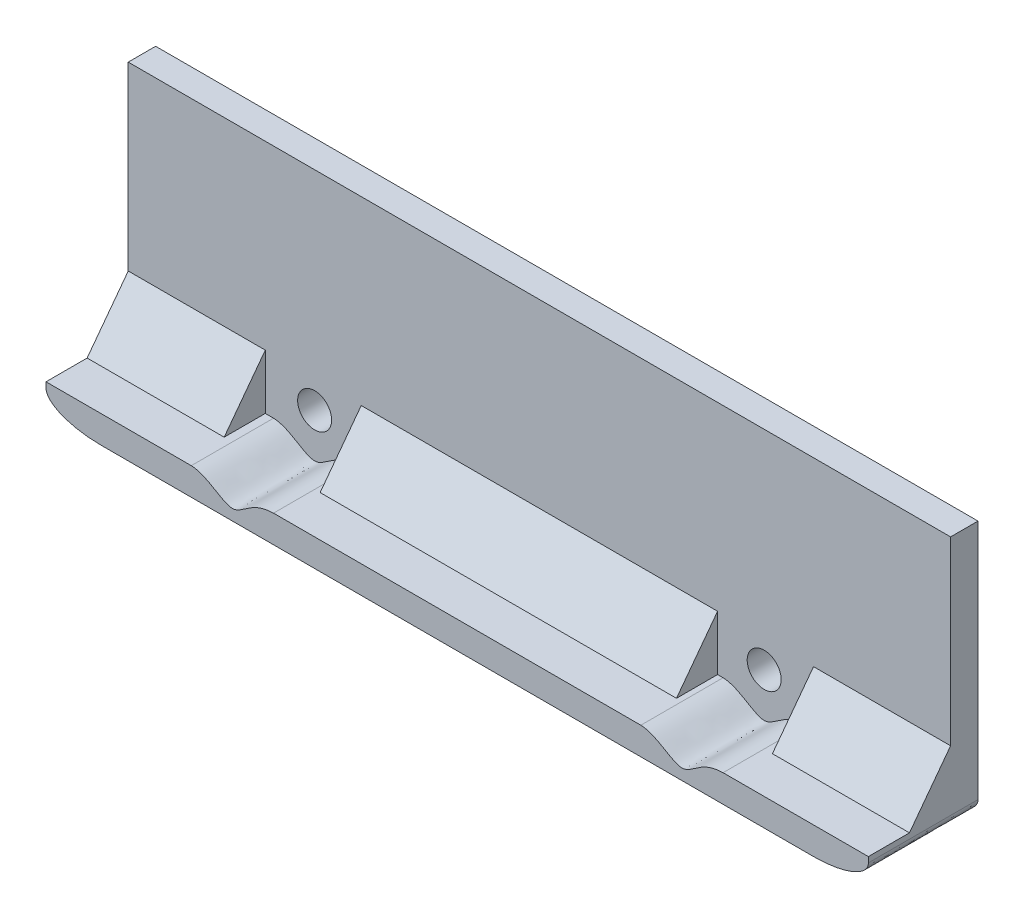
ISO-10303-21;
HEADER;
FILE_DESCRIPTION(('STEP AP214'),'2;1');
FILE_NAME('part.step','',(''),(''),'','','');
FILE_SCHEMA(('AUTOMOTIVE_DESIGN { 1 0 10303 214 1 1 1 1 }'));
ENDSEC;
DATA;
#1=APPLICATION_CONTEXT('core data for automotive mechanical design processes');
#2=APPLICATION_PROTOCOL_DEFINITION('international standard','automotive_design',2000,#1);
#3=PRODUCT_CONTEXT('',#1,'mechanical');
#4=PRODUCT('Part','Part','',(#3));
#5=PRODUCT_RELATED_PRODUCT_CATEGORY('part','',(#4));
#6=PRODUCT_DEFINITION_FORMATION('','',#4);
#7=PRODUCT_DEFINITION_CONTEXT('part definition',#1,'design');
#8=PRODUCT_DEFINITION('design','',#6,#7);
#9=PRODUCT_DEFINITION_SHAPE('','',#8);
#10=(LENGTH_UNIT() NAMED_UNIT(*) SI_UNIT(.MILLI.,.METRE.));
#11=(NAMED_UNIT(*) PLANE_ANGLE_UNIT() SI_UNIT($,.RADIAN.));
#12=(NAMED_UNIT(*) SI_UNIT($,.STERADIAN.) SOLID_ANGLE_UNIT());
#13=UNCERTAINTY_MEASURE_WITH_UNIT(LENGTH_MEASURE(1.E-05),#10,'distance_accuracy_value','');
#14=(GEOMETRIC_REPRESENTATION_CONTEXT(3) GLOBAL_UNCERTAINTY_ASSIGNED_CONTEXT((#13)) GLOBAL_UNIT_ASSIGNED_CONTEXT((#10,
#11,#12)) REPRESENTATION_CONTEXT('',''));
#15=CARTESIAN_POINT('',(0.,0.,0.));
#16=DIRECTION('',(0.,0.,1.));
#17=DIRECTION('',(1.,0.,0.));
#18=AXIS2_PLACEMENT_3D('',#15,#16,#17);
#19=CARTESIAN_POINT('',(0.,0.,5.));
#20=DIRECTION('',(0.,0.,-1.));
#21=DIRECTION('',(-1.,0.,0.));
#22=AXIS2_PLACEMENT_3D('',#19,#20,#21);
#23=PLANE('',#22);
#24=CARTESIAN_POINT('',(41.,10.,5.));
#25=DIRECTION('',(0.,0.,1.));
#26=DIRECTION('',(1.,0.,0.));
#27=AXIS2_PLACEMENT_3D('',#24,#25,#26);
#28=CIRCLE('',#27,3.1);
#29=CARTESIAN_POINT('',(44.1,10.,5.));
#30=VERTEX_POINT('',#29);
#31=EDGE_CURVE('E452',#30,#30,#28,.T.);
#32=ORIENTED_EDGE('',*,*,#31,.F.);
#33=EDGE_LOOP('',(#32));
#34=FACE_BOUND('',#33,.T.);
#35=CARTESIAN_POINT('',(-41.,9.99999999999999,5.));
#36=DIRECTION('',(0.,0.,1.));
#37=DIRECTION('',(1.,0.,0.));
#38=AXIS2_PLACEMENT_3D('',#35,#36,#37);
#39=CIRCLE('',#38,3.09999999999999);
#40=CARTESIAN_POINT('',(-37.9,9.99999999999999,5.));
#41=VERTEX_POINT('',#40);
#42=EDGE_CURVE('E365',#41,#41,#39,.T.);
#43=ORIENTED_EDGE('',*,*,#42,.F.);
#44=EDGE_LOOP('',(#43));
#45=FACE_BOUND('',#44,.T.);
#46=DIRECTION('',(1.,0.,0.));
#47=VECTOR('',#46,1.);
#48=CARTESIAN_POINT('',(0.,5.,5.));
#49=LINE('',#48,#47);
#50=CARTESIAN_POINT('',(-33.5,5.,5.));
#51=VERTEX_POINT('',#50);
#52=CARTESIAN_POINT('',(-32.5,4.99999999999545,4.99999999999545));
#53=VERTEX_POINT('',#52);
#54=EDGE_CURVE('E212',#51,#53,#49,.T.);
#55=ORIENTED_EDGE('',*,*,#54,.T.);
#56=DIRECTION('',(0.,1.,0.));
#57=VECTOR('',#56,1.);
#58=CARTESIAN_POINT('',(-32.5,-291549.6,4.99999999999545));
#59=LINE('',#58,#57);
#60=CARTESIAN_POINT('',(-32.5,14.9999999999864,4.99999999999545));
#61=VERTEX_POINT('',#60);
#62=EDGE_CURVE('E205',#53,#61,#59,.T.);
#63=ORIENTED_EDGE('',*,*,#62,.T.);
#64=DIRECTION('',(1.,0.,0.));
#65=VECTOR('',#64,1.);
#66=CARTESIAN_POINT('',(-32.5,14.9999999999864,4.99999999999545));
#67=LINE('',#66,#65);
#68=CARTESIAN_POINT('',(32.5,14.9999999999864,4.99999999999545));
#69=VERTEX_POINT('',#68);
#70=EDGE_CURVE('E188',#61,#69,#67,.T.);
#71=ORIENTED_EDGE('',*,*,#70,.T.);
#72=DIRECTION('',(0.,1.,0.));
#73=VECTOR('',#72,1.);
#74=CARTESIAN_POINT('',(32.5,-291549.6,4.99999999999545));
#75=LINE('',#74,#73);
#76=CARTESIAN_POINT('',(32.5,4.99999999999545,4.99999999999545));
#77=VERTEX_POINT('',#76);
#78=EDGE_CURVE('E221',#77,#69,#75,.T.);
#79=ORIENTED_EDGE('',*,*,#78,.F.);
#80=CARTESIAN_POINT('',(33.5,5.,5.));
#81=VERTEX_POINT('',#80);
#82=EDGE_CURVE('E474',#77,#81,#49,.T.);
#83=ORIENTED_EDGE('',*,*,#82,.T.);
#84=CARTESIAN_POINT('',(33.5,5.,5.));
#85=CARTESIAN_POINT('',(36.4768103069263,4.895138538773,5.));
#86=CARTESIAN_POINT('',(41.6709900792615,-0.895128502502221,5.));
#87=CARTESIAN_POINT('',(44.1812095345506,4.89511846623144,5.));
#88=CARTESIAN_POINT('',(48.5,5.,5.));
#89=B_SPLINE_CURVE_WITH_KNOTS('',3,(#84,#85,#86,#87,#88),.UNSPECIFIED.,.F.,.F.,(4,1,4),(0.,0.5,
1.),.UNSPECIFIED.);
#90=CARTESIAN_POINT('',(48.5,5.,5.));
#91=VERTEX_POINT('',#90);
#92=EDGE_CURVE('E460',#81,#91,#89,.T.);
#93=ORIENTED_EDGE('',*,*,#92,.T.);
#94=DIRECTION('',(1.,0.,0.));
#95=VECTOR('',#94,1.);
#96=CARTESIAN_POINT('',(0.,5.,5.));
#97=LINE('',#96,#95);
#98=CARTESIAN_POINT('',(50.,5.,5.));
#99=VERTEX_POINT('',#98);
#100=EDGE_CURVE('E486',#91,#99,#97,.T.);
#101=ORIENTED_EDGE('',*,*,#100,.T.);
#102=DIRECTION('',(0.,-1.,0.));
#103=VECTOR('',#102,1.);
#104=CARTESIAN_POINT('',(50.,0.,5.));
#105=LINE('',#104,#103);
#106=CARTESIAN_POINT('',(50.,15.,5.));
#107=VERTEX_POINT('',#106);
#108=EDGE_CURVE('E233',#107,#99,#105,.T.);
#109=ORIENTED_EDGE('',*,*,#108,.F.);
#110=DIRECTION('',(1.,0.,0.));
#111=VECTOR('',#110,1.);
#112=CARTESIAN_POINT('',(50.,15.,5.));
#113=LINE('',#112,#111);
#114=CARTESIAN_POINT('',(75.,15.,5.));
#115=VERTEX_POINT('',#114);
#116=EDGE_CURVE('E248',#107,#115,#113,.T.);
#117=ORIENTED_EDGE('',*,*,#116,.T.);
#118=DIRECTION('',(0.,1.,0.));
#119=VECTOR('',#118,1.);
#120=CARTESIAN_POINT('',(75.,0.,5.));
#121=LINE('',#120,#119);
#122=CARTESIAN_POINT('',(75.,48.,5.));
#123=VERTEX_POINT('',#122);
#124=EDGE_CURVE('E435',#115,#123,#121,.T.);
#125=ORIENTED_EDGE('',*,*,#124,.T.);
#126=DIRECTION('',(-1.,0.,0.));
#127=VECTOR('',#126,1.);
#128=CARTESIAN_POINT('',(-75.,48.,5.));
#129=LINE('',#128,#127);
#130=CARTESIAN_POINT('',(-75.,48.,5.));
#131=VERTEX_POINT('',#130);
#132=EDGE_CURVE('E369',#123,#131,#129,.T.);
#133=ORIENTED_EDGE('',*,*,#132,.T.);
#134=DIRECTION('',(0.,-1.,0.));
#135=VECTOR('',#134,1.);
#136=CARTESIAN_POINT('',(-75.,0.,5.));
#137=LINE('',#136,#135);
#138=CARTESIAN_POINT('',(-75.,15.,5.));
#139=VERTEX_POINT('',#138);
#140=EDGE_CURVE('E432',#131,#139,#137,.T.);
#141=ORIENTED_EDGE('',*,*,#140,.T.);
#142=DIRECTION('',(-1.,0.,0.));
#143=VECTOR('',#142,1.);
#144=CARTESIAN_POINT('',(-50.,15.,5.));
#145=LINE('',#144,#143);
#146=CARTESIAN_POINT('',(-50.,15.,5.));
#147=VERTEX_POINT('',#146);
#148=EDGE_CURVE('E268',#147,#139,#145,.T.);
#149=ORIENTED_EDGE('',*,*,#148,.F.);
#150=DIRECTION('',(0.,-1.,0.));
#151=VECTOR('',#150,1.);
#152=CARTESIAN_POINT('',(-50.,15.,5.));
#153=LINE('',#152,#151);
#154=CARTESIAN_POINT('',(-50.,5.,5.));
#155=VERTEX_POINT('',#154);
#156=EDGE_CURVE('E252',#147,#155,#153,.T.);
#157=ORIENTED_EDGE('',*,*,#156,.T.);
#158=DIRECTION('',(1.,0.,0.));
#159=VECTOR('',#158,1.);
#160=CARTESIAN_POINT('',(0.,5.,5.));
#161=LINE('',#160,#159);
#162=CARTESIAN_POINT('',(-48.5,5.,5.));
#163=VERTEX_POINT('',#162);
#164=EDGE_CURVE('E480',#155,#163,#161,.T.);
#165=ORIENTED_EDGE('',*,*,#164,.T.);
#166=CARTESIAN_POINT('',(-48.5,5.,5.));
#167=CARTESIAN_POINT('',(-45.5231896930737,4.895138538773,5.));
#168=CARTESIAN_POINT('',(-40.3290099207385,-0.895128502502221,5.));
#169=CARTESIAN_POINT('',(-37.8187904654494,4.89511846623144,5.));
#170=CARTESIAN_POINT('',(-33.5,5.,5.));
#171=B_SPLINE_CURVE_WITH_KNOTS('',3,(#166,#167,#168,#169,#170),.UNSPECIFIED.,.F.,.F.,(4,1,4),
(0.,0.5,1.),.UNSPECIFIED.);
#172=EDGE_CURVE('E475',#163,#51,#171,.T.);
#173=ORIENTED_EDGE('',*,*,#172,.T.);
#174=EDGE_LOOP('',(#55,#63,#71,#79,#83,#93,#101,#109,#117,#125,#133,#141,#149,#157,#165,#173));
#175=FACE_BOUND('',#174,.T.);
#176=ADVANCED_FACE('F49',(#34,#45,#175),#23,.F.);
#177=CARTESIAN_POINT('',(0.,5.,20.));
#178=DIRECTION('',(0.,1.,0.));
#179=DIRECTION('',(0.,0.,1.));
#180=AXIS2_PLACEMENT_3D('',#177,#178,#179);
#181=PLANE('',#180);
#182=DIRECTION('',(0.,0.,-1.));
#183=VECTOR('',#182,1.);
#184=CARTESIAN_POINT('',(75.,5.,20.));
#185=LINE('',#184,#183);
#186=CARTESIAN_POINT('',(75.,5.,20.));
#187=VERTEX_POINT('',#186);
#188=CARTESIAN_POINT('',(75.,5.,12.5));
#189=VERTEX_POINT('',#188);
#190=EDGE_CURVE('E505',#187,#189,#185,.T.);
#191=ORIENTED_EDGE('',*,*,#190,.T.);
#192=DIRECTION('',(1.,0.,0.));
#193=VECTOR('',#192,1.);
#194=CARTESIAN_POINT('',(50.,5.,12.5));
#195=LINE('',#194,#193);
#196=CARTESIAN_POINT('',(50.,5.,12.5));
#197=VERTEX_POINT('',#196);
#198=EDGE_CURVE('E241',#197,#189,#195,.T.);
#199=ORIENTED_EDGE('',*,*,#198,.F.);
#200=DIRECTION('',(0.,0.,1.));
#201=VECTOR('',#200,1.);
#202=CARTESIAN_POINT('',(50.,5.,5.));
#203=LINE('',#202,#201);
#204=EDGE_CURVE('E237',#99,#197,#203,.T.);
#205=ORIENTED_EDGE('',*,*,#204,.F.);
#206=ORIENTED_EDGE('',*,*,#100,.F.);
#207=DIRECTION('',(0.,0.,-1.));
#208=VECTOR('',#207,1.);
#209=CARTESIAN_POINT('',(48.5,5.,20.));
#210=LINE('',#209,#208);
#211=CARTESIAN_POINT('',(48.5,5.,20.));
#212=VERTEX_POINT('',#211);
#213=EDGE_CURVE('E392',#212,#91,#210,.T.);
#214=ORIENTED_EDGE('',*,*,#213,.F.);
#215=DIRECTION('',(1.,0.,0.));
#216=VECTOR('',#215,1.);
#217=CARTESIAN_POINT('',(0.,5.,20.));
#218=LINE('',#217,#216);
#219=EDGE_CURVE('E398',#212,#187,#218,.T.);
#220=ORIENTED_EDGE('',*,*,#219,.T.);
#221=EDGE_LOOP('',(#191,#199,#205,#206,#214,#220));
#222=FACE_BOUND('',#221,.T.);
#223=ADVANCED_FACE('F306',(#222),#181,.T.);
#224=CARTESIAN_POINT('',(0.,0.,0.));
#225=DIRECTION('',(0.,0.,-1.));
#226=DIRECTION('',(-1.,0.,0.));
#227=AXIS2_PLACEMENT_3D('',#224,#225,#226);
#228=PLANE('',#227);
#229=DIRECTION('',(0.,1.,0.));
#230=VECTOR('',#229,1.);
#231=CARTESIAN_POINT('',(75.,0.,0.));
#232=LINE('',#231,#230);
#233=CARTESIAN_POINT('',(75.,4.00000000000002,0.));
#234=VERTEX_POINT('',#233);
#235=CARTESIAN_POINT('',(75.,48.,0.));
#236=VERTEX_POINT('',#235);
#237=EDGE_CURVE('E378',#234,#236,#232,.T.);
#238=ORIENTED_EDGE('',*,*,#237,.F.);
#239=CARTESIAN_POINT('',(65.,0.,0.));
#240=CARTESIAN_POINT('',(75.,0.,0.));
#241=CARTESIAN_POINT('',(75.,4.00000000000002,0.));
#242=(BOUNDED_CURVE() B_SPLINE_CURVE(2,(#239,#240,#241),.UNSPECIFIED.,.F.,
.F.) B_SPLINE_CURVE_WITH_KNOTS((3,3),(0.,1.),
.UNSPECIFIED.) CURVE() GEOMETRIC_REPRESENTATION_ITEM() RATIONAL_B_SPLINE_CURVE((1.,
0.707106781186547,1.)) REPRESENTATION_ITEM(''));
#243=CARTESIAN_POINT('',(65.,0.,0.));
#244=VERTEX_POINT('',#243);
#245=EDGE_CURVE('E79',#234,#244,#242,.F.);
#246=ORIENTED_EDGE('',*,*,#245,.T.);
#247=DIRECTION('',(1.,0.,0.));
#248=VECTOR('',#247,1.);
#249=CARTESIAN_POINT('',(-75.,0.,0.));
#250=LINE('',#249,#248);
#251=CARTESIAN_POINT('',(-65.,0.,0.));
#252=VERTEX_POINT('',#251);
#253=EDGE_CURVE('E364',#252,#244,#250,.T.);
#254=ORIENTED_EDGE('',*,*,#253,.F.);
#255=CARTESIAN_POINT('',(-75.,4.,0.));
#256=CARTESIAN_POINT('',(-75.,0.,0.));
#257=CARTESIAN_POINT('',(-65.,0.,0.));
#258=(BOUNDED_CURVE() B_SPLINE_CURVE(2,(#255,#256,#257),.UNSPECIFIED.,.F.,
.F.) B_SPLINE_CURVE_WITH_KNOTS((3,3),(0.,1.),
.UNSPECIFIED.) CURVE() GEOMETRIC_REPRESENTATION_ITEM() RATIONAL_B_SPLINE_CURVE((1.,
0.707106781186548,1.)) REPRESENTATION_ITEM(''));
#259=CARTESIAN_POINT('',(-75.,4.,0.));
#260=VERTEX_POINT('',#259);
#261=EDGE_CURVE('E611',#252,#260,#258,.F.);
#262=ORIENTED_EDGE('',*,*,#261,.T.);
#263=DIRECTION('',(0.,-1.,0.));
#264=VECTOR('',#263,1.);
#265=CARTESIAN_POINT('',(-75.,0.,0.));
#266=LINE('',#265,#264);
#267=CARTESIAN_POINT('',(-75.,48.,0.));
#268=VERTEX_POINT('',#267);
#269=EDGE_CURVE('E355',#268,#260,#266,.T.);
#270=ORIENTED_EDGE('',*,*,#269,.F.);
#271=DIRECTION('',(-1.,0.,0.));
#272=VECTOR('',#271,1.);
#273=CARTESIAN_POINT('',(-75.,48.,0.));
#274=LINE('',#273,#272);
#275=EDGE_CURVE('E404',#236,#268,#274,.T.);
#276=ORIENTED_EDGE('',*,*,#275,.F.);
#277=EDGE_LOOP('',(#238,#246,#254,#262,#270,#276));
#278=FACE_BOUND('',#277,.T.);
#279=CARTESIAN_POINT('',(-41.,9.99999999999999,0.));
#280=DIRECTION('',(0.,0.,1.));
#281=DIRECTION('',(1.,0.,0.));
#282=AXIS2_PLACEMENT_3D('',#279,#280,#281);
#283=CIRCLE('',#282,3.09999999999999);
#284=CARTESIAN_POINT('',(-37.9,9.99999999999999,0.));
#285=VERTEX_POINT('',#284);
#286=EDGE_CURVE('E448',#285,#285,#283,.T.);
#287=ORIENTED_EDGE('',*,*,#286,.T.);
#288=EDGE_LOOP('',(#287));
#289=FACE_BOUND('',#288,.T.);
#290=CARTESIAN_POINT('',(41.,10.,0.));
#291=DIRECTION('',(0.,0.,1.));
#292=DIRECTION('',(1.,0.,0.));
#293=AXIS2_PLACEMENT_3D('',#290,#291,#292);
#294=CIRCLE('',#293,3.1);
#295=CARTESIAN_POINT('',(44.1,10.,0.));
#296=VERTEX_POINT('',#295);
#297=EDGE_CURVE('E456',#296,#296,#294,.T.);
#298=ORIENTED_EDGE('',*,*,#297,.T.);
#299=EDGE_LOOP('',(#298));
#300=FACE_BOUND('',#299,.T.);
#301=ADVANCED_FACE('F308',(#278,#289,#300),#228,.T.);
#302=CARTESIAN_POINT('',(-75.,0.,5.));
#303=DIRECTION('',(1.,0.,0.));
#304=DIRECTION('',(0.,0.,-1.));
#305=AXIS2_PLACEMENT_3D('',#302,#303,#304);
#306=PLANE('',#305);
#307=ORIENTED_EDGE('',*,*,#269,.T.);
#308=CARTESIAN_POINT('',(-75.,4.,21.));
#309=CARTESIAN_POINT('',(-75.,4.,13.6666666666667));
#310=CARTESIAN_POINT('',(-75.,4.,6.33333333333333));
#311=CARTESIAN_POINT('',(-75.,4.,-0.999999999999997));
#312=(BOUNDED_CURVE() B_SPLINE_CURVE(3,(#308,#309,#310,#311),.UNSPECIFIED.,.F.,
.F.) B_SPLINE_CURVE_WITH_KNOTS((4,4),(-0.016,0.006),
.UNSPECIFIED.) CURVE() GEOMETRIC_REPRESENTATION_ITEM() RATIONAL_B_SPLINE_CURVE((1.,1.,1.,1.)) REPRESENTATION_ITEM(''));
#313=CARTESIAN_POINT('',(-75.,4.,20.));
#314=VERTEX_POINT('',#313);
#315=EDGE_CURVE('E543',#260,#314,#312,.F.);
#316=ORIENTED_EDGE('',*,*,#315,.T.);
#317=DIRECTION('',(0.,1.,0.));
#318=VECTOR('',#317,1.);
#319=CARTESIAN_POINT('',(-75.,0.,20.));
#320=LINE('',#319,#318);
#321=CARTESIAN_POINT('',(-75.,5.,20.));
#322=VERTEX_POINT('',#321);
#323=EDGE_CURVE('E385',#314,#322,#320,.T.);
#324=ORIENTED_EDGE('',*,*,#323,.T.);
#325=DIRECTION('',(0.,0.,-1.));
#326=VECTOR('',#325,1.);
#327=CARTESIAN_POINT('',(-75.,5.,20.));
#328=LINE('',#327,#326);
#329=CARTESIAN_POINT('',(-75.,5.,12.5));
#330=VERTEX_POINT('',#329);
#331=EDGE_CURVE('E502',#322,#330,#328,.T.);
#332=ORIENTED_EDGE('',*,*,#331,.T.);
#333=DIRECTION('',(0.,0.8,-0.6));
#334=VECTOR('',#333,1.);
#335=CARTESIAN_POINT('',(-75.,5.,12.5));
#336=LINE('',#335,#334);
#337=EDGE_CURVE('E251',#330,#139,#336,.T.);
#338=ORIENTED_EDGE('',*,*,#337,.T.);
#339=ORIENTED_EDGE('',*,*,#140,.F.);
#340=DIRECTION('',(0.,0.,-1.));
#341=VECTOR('',#340,1.);
#342=CARTESIAN_POINT('',(-75.,48.,5.));
#343=LINE('',#342,#341);
#344=EDGE_CURVE('E437',#131,#268,#343,.T.);
#345=ORIENTED_EDGE('',*,*,#344,.T.);
#346=EDGE_LOOP('',(#307,#316,#324,#332,#338,#339,#345));
#347=FACE_BOUND('',#346,.T.);
#348=ADVANCED_FACE('F312',(#347),#306,.F.);
#349=CARTESIAN_POINT('',(-75.,0.,5.));
#350=DIRECTION('',(0.,1.,0.));
#351=DIRECTION('',(-1.,0.,0.));
#352=AXIS2_PLACEMENT_3D('',#349,#350,#351);
#353=PLANE('',#352);
#354=ORIENTED_EDGE('',*,*,#253,.T.);
#355=CARTESIAN_POINT('',(65.,0.,21.));
#356=CARTESIAN_POINT('',(65.,0.,13.6666666666667));
#357=CARTESIAN_POINT('',(65.,0.,6.33333333333333));
#358=CARTESIAN_POINT('',(65.,0.,-0.999999999999997));
#359=(BOUNDED_CURVE() B_SPLINE_CURVE(3,(#355,#356,#357,#358),.UNSPECIFIED.,.F.,
.F.) B_SPLINE_CURVE_WITH_KNOTS((4,4),(-0.016,0.006),
.UNSPECIFIED.) CURVE() GEOMETRIC_REPRESENTATION_ITEM() RATIONAL_B_SPLINE_CURVE((1.,1.,1.,1.)) REPRESENTATION_ITEM(''));
#360=CARTESIAN_POINT('',(65.,0.,20.));
#361=VERTEX_POINT('',#360);
#362=EDGE_CURVE('E64',#244,#361,#359,.F.);
#363=ORIENTED_EDGE('',*,*,#362,.T.);
#364=DIRECTION('',(1.,0.,0.));
#365=VECTOR('',#364,1.);
#366=CARTESIAN_POINT('',(0.,0.,20.));
#367=LINE('',#366,#365);
#368=CARTESIAN_POINT('',(-65.,0.,20.));
#369=VERTEX_POINT('',#368);
#370=EDGE_CURVE('E381',#369,#361,#367,.T.);
#371=ORIENTED_EDGE('',*,*,#370,.F.);
#372=CARTESIAN_POINT('',(-65.,0.,-0.999999999999997));
#373=CARTESIAN_POINT('',(-65.,0.,6.33333333333333));
#374=CARTESIAN_POINT('',(-65.,0.,13.6666666666667));
#375=CARTESIAN_POINT('',(-65.,0.,21.));
#376=(BOUNDED_CURVE() B_SPLINE_CURVE(3,(#372,#373,#374,#375),.UNSPECIFIED.,.F.,
.F.) B_SPLINE_CURVE_WITH_KNOTS((4,4),(-0.016,0.006),
.UNSPECIFIED.) CURVE() GEOMETRIC_REPRESENTATION_ITEM() RATIONAL_B_SPLINE_CURVE((1.,1.,1.,1.)) REPRESENTATION_ITEM(''));
#377=EDGE_CURVE('E443',#369,#252,#376,.F.);
#378=ORIENTED_EDGE('',*,*,#377,.T.);
#379=EDGE_LOOP('',(#354,#363,#371,#378));
#380=FACE_BOUND('',#379,.T.);
#381=ADVANCED_FACE('F335',(#380),#353,.F.);
#382=CARTESIAN_POINT('',(75.,0.,5.));
#383=DIRECTION('',(-1.,0.,0.));
#384=DIRECTION('',(0.,-1.,0.));
#385=AXIS2_PLACEMENT_3D('',#382,#383,#384);
#386=PLANE('',#385);
#387=DIRECTION('',(0.,1.,0.));
#388=VECTOR('',#387,1.);
#389=CARTESIAN_POINT('',(75.,0.,20.));
#390=LINE('',#389,#388);
#391=CARTESIAN_POINT('',(75.,4.00000000000002,20.));
#392=VERTEX_POINT('',#391);
#393=EDGE_CURVE('E384',#392,#187,#390,.T.);
#394=ORIENTED_EDGE('',*,*,#393,.F.);
#395=CARTESIAN_POINT('',(75.,4.00000000000002,-0.999999999999997));
#396=CARTESIAN_POINT('',(75.,4.00000000000002,6.33333333333333));
#397=CARTESIAN_POINT('',(75.,4.00000000000002,13.6666666666667));
#398=CARTESIAN_POINT('',(75.,4.00000000000002,21.));
#399=(BOUNDED_CURVE() B_SPLINE_CURVE(3,(#395,#396,#397,#398),.UNSPECIFIED.,.F.,
.F.) B_SPLINE_CURVE_WITH_KNOTS((4,4),(-0.016,0.006),
.UNSPECIFIED.) CURVE() GEOMETRIC_REPRESENTATION_ITEM() RATIONAL_B_SPLINE_CURVE((1.,1.,1.,1.)) REPRESENTATION_ITEM(''));
#400=EDGE_CURVE('E409',#392,#234,#399,.F.);
#401=ORIENTED_EDGE('',*,*,#400,.T.);
#402=ORIENTED_EDGE('',*,*,#237,.T.);
#403=DIRECTION('',(0.,0.,-1.));
#404=VECTOR('',#403,1.);
#405=CARTESIAN_POINT('',(75.,48.,5.));
#406=LINE('',#405,#404);
#407=EDGE_CURVE('E379',#123,#236,#406,.T.);
#408=ORIENTED_EDGE('',*,*,#407,.F.);
#409=ORIENTED_EDGE('',*,*,#124,.F.);
#410=DIRECTION('',(0.,0.8,-0.6));
#411=VECTOR('',#410,1.);
#412=CARTESIAN_POINT('',(75.,5.40000000000001,12.2));
#413=LINE('',#412,#411);
#414=EDGE_CURVE('E227',#189,#115,#413,.T.);
#415=ORIENTED_EDGE('',*,*,#414,.F.);
#416=ORIENTED_EDGE('',*,*,#190,.F.);
#417=EDGE_LOOP('',(#394,#401,#402,#408,#409,#415,#416));
#418=FACE_BOUND('',#417,.T.);
#419=ADVANCED_FACE('F344',(#418),#386,.F.);
#420=CARTESIAN_POINT('',(-75.,48.,5.));
#421=DIRECTION('',(0.,-1.,0.));
#422=DIRECTION('',(1.,0.,0.));
#423=AXIS2_PLACEMENT_3D('',#420,#421,#422);
#424=PLANE('',#423);
#425=ORIENTED_EDGE('',*,*,#275,.T.);
#426=ORIENTED_EDGE('',*,*,#344,.F.);
#427=ORIENTED_EDGE('',*,*,#132,.F.);
#428=ORIENTED_EDGE('',*,*,#407,.T.);
#429=EDGE_LOOP('',(#425,#426,#427,#428));
#430=FACE_BOUND('',#429,.T.);
#431=ADVANCED_FACE('F302',(#430),#424,.F.);
#432=CARTESIAN_POINT('',(-41.,9.99999999999999,5.));
#433=DIRECTION('',(0.,0.,-1.));
#434=DIRECTION('',(-1.,0.,0.));
#435=AXIS2_PLACEMENT_3D('',#432,#433,#434);
#436=CYLINDRICAL_SURFACE('',#435,3.09999999999999);
#437=ORIENTED_EDGE('',*,*,#42,.T.);
#438=EDGE_LOOP('',(#437));
#439=FACE_BOUND('',#438,.T.);
#440=ORIENTED_EDGE('',*,*,#286,.F.);
#441=EDGE_LOOP('',(#440));
#442=FACE_BOUND('',#441,.T.);
#443=ADVANCED_FACE('F298',(#439,#442),#436,.F.);
#444=CARTESIAN_POINT('',(41.,10.,5.));
#445=DIRECTION('',(0.,0.,-1.));
#446=DIRECTION('',(-1.,0.,0.));
#447=AXIS2_PLACEMENT_3D('',#444,#445,#446);
#448=CYLINDRICAL_SURFACE('',#447,3.1);
#449=ORIENTED_EDGE('',*,*,#31,.T.);
#450=EDGE_LOOP('',(#449));
#451=FACE_BOUND('',#450,.T.);
#452=ORIENTED_EDGE('',*,*,#297,.F.);
#453=EDGE_LOOP('',(#452));
#454=FACE_BOUND('',#453,.T.);
#455=ADVANCED_FACE('F292',(#451,#454),#448,.F.);
#456=CARTESIAN_POINT('',(33.5,5.,20.));
#457=CARTESIAN_POINT('',(36.4768103069263,4.895138538773,20.));
#458=CARTESIAN_POINT('',(41.6709900792615,-0.895128502502221,20.));
#459=CARTESIAN_POINT('',(44.1812095345506,4.89511846623144,20.));
#460=CARTESIAN_POINT('',(48.5,5.,20.));
#461=B_SPLINE_CURVE_WITH_KNOTS('',3,(#456,#457,#458,#459,#460),.UNSPECIFIED.,.F.,.F.,(4,1,4),
(0.,0.5,1.),.UNSPECIFIED.);
#462=DIRECTION('',(0.,0.,-1.));
#463=VECTOR('',#462,1.);
#464=SURFACE_OF_LINEAR_EXTRUSION('',#461,#463);
#465=ORIENTED_EDGE('',*,*,#92,.F.);
#466=DIRECTION('',(0.,0.,-1.));
#467=VECTOR('',#466,1.);
#468=CARTESIAN_POINT('',(33.5,5.,20.));
#469=LINE('',#468,#467);
#470=CARTESIAN_POINT('',(33.5,5.,20.));
#471=VERTEX_POINT('',#470);
#472=EDGE_CURVE('E490',#471,#81,#469,.T.);
#473=ORIENTED_EDGE('',*,*,#472,.F.);
#474=EDGE_CURVE('E271',#471,#212,#461,.T.);
#475=ORIENTED_EDGE('',*,*,#474,.T.);
#476=ORIENTED_EDGE('',*,*,#213,.T.);
#477=EDGE_LOOP('',(#465,#473,#475,#476));
#478=FACE_BOUND('',#477,.T.);
#479=ADVANCED_FACE('F287',(#478),#464,.T.);
#480=DIRECTION('',(0.,0.,-1.));
#481=VECTOR('',#480,1.);
#482=CARTESIAN_POINT('',(-32.5,4.99999999999545,400010.));
#483=LINE('',#482,#481);
#484=CARTESIAN_POINT('',(-32.5,4.99999999999545,12.4999999999886));
#485=VERTEX_POINT('',#484);
#486=EDGE_CURVE('E201',#485,#53,#483,.T.);
#487=ORIENTED_EDGE('',*,*,#486,.T.);
#488=ORIENTED_EDGE('',*,*,#54,.F.);
#489=DIRECTION('',(0.,0.,-1.));
#490=VECTOR('',#489,1.);
#491=CARTESIAN_POINT('',(-33.5,5.,20.));
#492=LINE('',#491,#490);
#493=CARTESIAN_POINT('',(-33.5,5.,20.));
#494=VERTEX_POINT('',#493);
#495=EDGE_CURVE('E494',#494,#51,#492,.T.);
#496=ORIENTED_EDGE('',*,*,#495,.F.);
#497=EDGE_CURVE('E281',#494,#471,#218,.T.);
#498=ORIENTED_EDGE('',*,*,#497,.T.);
#499=ORIENTED_EDGE('',*,*,#472,.T.);
#500=ORIENTED_EDGE('',*,*,#82,.F.);
#501=DIRECTION('',(0.,0.,-1.));
#502=VECTOR('',#501,1.);
#503=CARTESIAN_POINT('',(32.5,4.99999999999545,400010.));
#504=LINE('',#503,#502);
#505=CARTESIAN_POINT('',(32.5,5.,12.4999999999886));
#506=VERTEX_POINT('',#505);
#507=EDGE_CURVE('E214',#506,#77,#504,.T.);
#508=ORIENTED_EDGE('',*,*,#507,.F.);
#509=DIRECTION('',(1.,0.,0.));
#510=VECTOR('',#509,1.);
#511=CARTESIAN_POINT('',(-32.5,4.99999999999545,12.4999999999886));
#512=LINE('',#511,#510);
#513=EDGE_CURVE('E200',#485,#506,#512,.T.);
#514=ORIENTED_EDGE('',*,*,#513,.F.);
#515=EDGE_LOOP('',(#487,#488,#496,#498,#499,#500,#508,#514));
#516=FACE_BOUND('',#515,.T.);
#517=ADVANCED_FACE('F291',(#516),#181,.T.);
#518=CARTESIAN_POINT('',(-48.5,5.,20.));
#519=CARTESIAN_POINT('',(-45.5231896930737,4.895138538773,20.));
#520=CARTESIAN_POINT('',(-40.3290099207385,-0.895128502502221,20.));
#521=CARTESIAN_POINT('',(-37.8187904654494,4.89511846623144,20.));
#522=CARTESIAN_POINT('',(-33.5,5.,20.));
#523=B_SPLINE_CURVE_WITH_KNOTS('',3,(#518,#519,#520,#521,#522),.UNSPECIFIED.,.F.,.F.,(4,1,4),
(0.,0.5,1.),.UNSPECIFIED.);
#524=DIRECTION('',(0.,0.,-1.));
#525=VECTOR('',#524,1.);
#526=SURFACE_OF_LINEAR_EXTRUSION('',#523,#525);
#527=ORIENTED_EDGE('',*,*,#172,.F.);
#528=DIRECTION('',(0.,0.,-1.));
#529=VECTOR('',#528,1.);
#530=CARTESIAN_POINT('',(-48.5,5.,20.));
#531=LINE('',#530,#529);
#532=CARTESIAN_POINT('',(-48.5,5.,20.));
#533=VERTEX_POINT('',#532);
#534=EDGE_CURVE('E498',#533,#163,#531,.T.);
#535=ORIENTED_EDGE('',*,*,#534,.F.);
#536=EDGE_CURVE('E517',#533,#494,#523,.T.);
#537=ORIENTED_EDGE('',*,*,#536,.T.);
#538=ORIENTED_EDGE('',*,*,#495,.T.);
#539=EDGE_LOOP('',(#527,#535,#537,#538));
#540=FACE_BOUND('',#539,.T.);
#541=ADVANCED_FACE('F294',(#540),#526,.T.);
#542=DIRECTION('',(-1.,0.,0.));
#543=VECTOR('',#542,1.);
#544=CARTESIAN_POINT('',(-50.,5.,12.5));
#545=LINE('',#544,#543);
#546=CARTESIAN_POINT('',(-50.,5.,12.5));
#547=VERTEX_POINT('',#546);
#548=EDGE_CURVE('E264',#547,#330,#545,.T.);
#549=ORIENTED_EDGE('',*,*,#548,.T.);
#550=ORIENTED_EDGE('',*,*,#331,.F.);
#551=EDGE_CURVE('E513',#322,#533,#218,.T.);
#552=ORIENTED_EDGE('',*,*,#551,.T.);
#553=ORIENTED_EDGE('',*,*,#534,.T.);
#554=ORIENTED_EDGE('',*,*,#164,.F.);
#555=DIRECTION('',(0.,0.,1.));
#556=VECTOR('',#555,1.);
#557=CARTESIAN_POINT('',(-50.,5.,5.));
#558=LINE('',#557,#556);
#559=EDGE_CURVE('E256',#155,#547,#558,.T.);
#560=ORIENTED_EDGE('',*,*,#559,.T.);
#561=EDGE_LOOP('',(#549,#550,#552,#553,#554,#560));
#562=FACE_BOUND('',#561,.T.);
#563=ADVANCED_FACE('F540',(#562),#181,.T.);
#564=CARTESIAN_POINT('',(0.,0.,20.));
#565=DIRECTION('',(0.,0.,1.));
#566=DIRECTION('',(1.,0.,0.));
#567=AXIS2_PLACEMENT_3D('',#564,#565,#566);
#568=PLANE('',#567);
#569=ORIENTED_EDGE('',*,*,#370,.T.);
#570=CARTESIAN_POINT('',(75.,4.00000000000002,20.));
#571=CARTESIAN_POINT('',(75.,0.,20.));
#572=CARTESIAN_POINT('',(65.,0.,20.));
#573=(BOUNDED_CURVE() B_SPLINE_CURVE(2,(#570,#571,#572),.UNSPECIFIED.,.F.,
.F.) B_SPLINE_CURVE_WITH_KNOTS((3,3),(0.,1.),
.UNSPECIFIED.) CURVE() GEOMETRIC_REPRESENTATION_ITEM() RATIONAL_B_SPLINE_CURVE((1.,
0.707106781186547,1.)) REPRESENTATION_ITEM(''));
#574=EDGE_CURVE('E12',#361,#392,#573,.F.);
#575=ORIENTED_EDGE('',*,*,#574,.T.);
#576=ORIENTED_EDGE('',*,*,#393,.T.);
#577=ORIENTED_EDGE('',*,*,#219,.F.);
#578=ORIENTED_EDGE('',*,*,#474,.F.);
#579=ORIENTED_EDGE('',*,*,#497,.F.);
#580=ORIENTED_EDGE('',*,*,#536,.F.);
#581=ORIENTED_EDGE('',*,*,#551,.F.);
#582=ORIENTED_EDGE('',*,*,#323,.F.);
#583=CARTESIAN_POINT('',(-65.,0.,20.));
#584=CARTESIAN_POINT('',(-75.,0.,20.));
#585=CARTESIAN_POINT('',(-75.,4.,20.));
#586=(BOUNDED_CURVE() B_SPLINE_CURVE(2,(#583,#584,#585),.UNSPECIFIED.,.F.,
.F.) B_SPLINE_CURVE_WITH_KNOTS((3,3),(0.,1.),
.UNSPECIFIED.) CURVE() GEOMETRIC_REPRESENTATION_ITEM() RATIONAL_B_SPLINE_CURVE((1.,
0.707106781186548,1.)) REPRESENTATION_ITEM(''));
#587=EDGE_CURVE('E424',#314,#369,#586,.F.);
#588=ORIENTED_EDGE('',*,*,#587,.T.);
#589=EDGE_LOOP('',(#569,#575,#576,#577,#578,#579,#580,#581,#582,#588));
#590=FACE_BOUND('',#589,.T.);
#591=ADVANCED_FACE('F535',(#590),#568,.T.);
#592=CARTESIAN_POINT('',(-50.,5.,12.5));
#593=DIRECTION('',(0.,0.6,0.8));
#594=DIRECTION('',(0.,-0.8,0.6));
#595=AXIS2_PLACEMENT_3D('',#592,#593,#594);
#596=PLANE('',#595);
#597=ORIENTED_EDGE('',*,*,#337,.F.);
#598=ORIENTED_EDGE('',*,*,#548,.F.);
#599=DIRECTION('',(0.,0.8,-0.6));
#600=VECTOR('',#599,1.);
#601=CARTESIAN_POINT('',(-50.,5.,12.5));
#602=LINE('',#601,#600);
#603=EDGE_CURVE('E260',#547,#147,#602,.T.);
#604=ORIENTED_EDGE('',*,*,#603,.T.);
#605=ORIENTED_EDGE('',*,*,#148,.T.);
#606=EDGE_LOOP('',(#597,#598,#604,#605));
#607=FACE_BOUND('',#606,.T.);
#608=ADVANCED_FACE('F570',(#607),#596,.T.);
#609=CARTESIAN_POINT('',(-50.,0.,0.));
#610=DIRECTION('',(-1.,0.,0.));
#611=DIRECTION('',(0.,0.,1.));
#612=AXIS2_PLACEMENT_3D('',#609,#610,#611);
#613=PLANE('',#612);
#614=ORIENTED_EDGE('',*,*,#156,.F.);
#615=ORIENTED_EDGE('',*,*,#603,.F.);
#616=ORIENTED_EDGE('',*,*,#559,.F.);
#617=EDGE_LOOP('',(#614,#615,#616));
#618=FACE_BOUND('',#617,.T.);
#619=ADVANCED_FACE('F713',(#618),#613,.F.);
#620=CARTESIAN_POINT('',(50.,5.40000000000001,12.2));
#621=DIRECTION('',(0.,-0.6,-0.8));
#622=DIRECTION('',(0.,0.8,-0.6));
#623=AXIS2_PLACEMENT_3D('',#620,#621,#622);
#624=PLANE('',#623);
#625=ORIENTED_EDGE('',*,*,#414,.T.);
#626=ORIENTED_EDGE('',*,*,#116,.F.);
#627=DIRECTION('',(0.,0.8,-0.6));
#628=VECTOR('',#627,1.);
#629=CARTESIAN_POINT('',(50.,5.40000000000001,12.2));
#630=LINE('',#629,#628);
#631=EDGE_CURVE('E229',#197,#107,#630,.T.);
#632=ORIENTED_EDGE('',*,*,#631,.F.);
#633=ORIENTED_EDGE('',*,*,#198,.T.);
#634=EDGE_LOOP('',(#625,#626,#632,#633));
#635=FACE_BOUND('',#634,.T.);
#636=ADVANCED_FACE('F710',(#635),#624,.F.);
#637=CARTESIAN_POINT('',(50.,0.,0.));
#638=DIRECTION('',(1.,0.,0.));
#639=DIRECTION('',(0.,1.,0.));
#640=AXIS2_PLACEMENT_3D('',#637,#638,#639);
#641=PLANE('',#640);
#642=ORIENTED_EDGE('',*,*,#631,.T.);
#643=ORIENTED_EDGE('',*,*,#108,.T.);
#644=ORIENTED_EDGE('',*,*,#204,.T.);
#645=EDGE_LOOP('',(#642,#643,#644));
#646=FACE_BOUND('',#645,.T.);
#647=ADVANCED_FACE('F707',(#646),#641,.F.);
#648=CARTESIAN_POINT('',(-32.5,-378588.744,283957.808));
#649=DIRECTION('',(0.,0.6,0.8));
#650=DIRECTION('',(0.,-0.8,0.6));
#651=AXIS2_PLACEMENT_3D('',#648,#649,#650);
#652=PLANE('',#651);
#653=DIRECTION('',(0.,-0.8,0.6));
#654=VECTOR('',#653,1.);
#655=CARTESIAN_POINT('',(32.5,-378588.744,283957.808));
#656=LINE('',#655,#654);
#657=EDGE_CURVE('E194',#69,#506,#656,.T.);
#658=ORIENTED_EDGE('',*,*,#657,.F.);
#659=ORIENTED_EDGE('',*,*,#70,.F.);
#660=DIRECTION('',(0.,-0.8,0.6));
#661=VECTOR('',#660,1.);
#662=CARTESIAN_POINT('',(-32.5,-378588.744,283957.808));
#663=LINE('',#662,#661);
#664=EDGE_CURVE('E192',#61,#485,#663,.T.);
#665=ORIENTED_EDGE('',*,*,#664,.T.);
#666=ORIENTED_EDGE('',*,*,#513,.T.);
#667=EDGE_LOOP('',(#658,#659,#665,#666));
#668=FACE_BOUND('',#667,.T.);
#669=ADVANCED_FACE('F190',(#668),#652,.T.);
#670=CARTESIAN_POINT('',(-32.5,0.,0.));
#671=DIRECTION('',(-1.,0.,0.));
#672=DIRECTION('',(0.,0.,1.));
#673=AXIS2_PLACEMENT_3D('',#670,#671,#672);
#674=PLANE('',#673);
#675=ORIENTED_EDGE('',*,*,#62,.F.);
#676=ORIENTED_EDGE('',*,*,#486,.F.);
#677=ORIENTED_EDGE('',*,*,#664,.F.);
#678=EDGE_LOOP('',(#675,#676,#677));
#679=FACE_BOUND('',#678,.T.);
#680=ADVANCED_FACE('F204',(#679),#674,.T.);
#681=CARTESIAN_POINT('',(32.5,0.,0.));
#682=DIRECTION('',(-1.,0.,0.));
#683=DIRECTION('',(0.,0.,1.));
#684=AXIS2_PLACEMENT_3D('',#681,#682,#683);
#685=PLANE('',#684);
#686=ORIENTED_EDGE('',*,*,#78,.T.);
#687=ORIENTED_EDGE('',*,*,#657,.T.);
#688=ORIENTED_EDGE('',*,*,#507,.T.);
#689=EDGE_LOOP('',(#686,#687,#688));
#690=FACE_BOUND('',#689,.T.);
#691=ADVANCED_FACE('F634',(#690),#685,.F.);
#692=CARTESIAN_POINT('',(-65.,0.,21.));
#693=CARTESIAN_POINT('',(-65.,0.,13.6666666666667));
#694=CARTESIAN_POINT('',(-65.,0.,6.33333333333333));
#695=CARTESIAN_POINT('',(-65.,0.,-0.999999999999997));
#696=CARTESIAN_POINT('',(-75.,0.,21.));
#697=CARTESIAN_POINT('',(-75.,0.,13.6666666666667));
#698=CARTESIAN_POINT('',(-75.,0.,6.33333333333334));
#699=CARTESIAN_POINT('',(-75.,0.,-0.999999999999997));
#700=CARTESIAN_POINT('',(-75.,4.,21.));
#701=CARTESIAN_POINT('',(-75.,4.,13.6666666666667));
#702=CARTESIAN_POINT('',(-75.,4.,6.33333333333333));
#703=CARTESIAN_POINT('',(-75.,4.,-0.999999999999997));
#704=(BOUNDED_SURFACE() B_SPLINE_SURFACE(2,3,((#692,#693,#694,#695),(#696,#697,#698,#699),(#700,
#701,#702,#703)),.UNSPECIFIED.,.F.,.F.,.F.) B_SPLINE_SURFACE_WITH_KNOTS((3,3),(4,4),(0.,1.),
(-0.016,0.006),.UNSPECIFIED.) GEOMETRIC_REPRESENTATION_ITEM() RATIONAL_B_SPLINE_SURFACE(((1.,1.,
1.,1.),(0.707106781186548,0.707106781186548,0.707106781186548,0.707106781186548),(1.,1.,1.,1.))) REPRESENTATION_ITEM('') SURFACE());
#705=ORIENTED_EDGE('',*,*,#587,.F.);
#706=ORIENTED_EDGE('',*,*,#315,.F.);
#707=ORIENTED_EDGE('',*,*,#261,.F.);
#708=ORIENTED_EDGE('',*,*,#377,.F.);
#709=EDGE_LOOP('',(#705,#706,#707,#708));
#710=FACE_BOUND('',#709,.T.);
#711=ADVANCED_FACE('F616',(#710),#704,.T.);
#712=CARTESIAN_POINT('',(75.,4.00000000000002,21.));
#713=CARTESIAN_POINT('',(75.,4.00000000000002,13.6666666666667));
#714=CARTESIAN_POINT('',(75.,4.00000000000002,6.33333333333333));
#715=CARTESIAN_POINT('',(75.,4.00000000000002,-0.999999999999997));
#716=CARTESIAN_POINT('',(75.,0.,21.));
#717=CARTESIAN_POINT('',(75.,0.,13.6666666666667));
#718=CARTESIAN_POINT('',(75.,0.,6.33333333333335));
#719=CARTESIAN_POINT('',(75.,0.,-0.999999999999997));
#720=CARTESIAN_POINT('',(65.,0.,21.));
#721=CARTESIAN_POINT('',(65.,0.,13.6666666666667));
#722=CARTESIAN_POINT('',(65.,0.,6.33333333333333));
#723=CARTESIAN_POINT('',(65.,0.,-0.999999999999997));
#724=(BOUNDED_SURFACE() B_SPLINE_SURFACE(2,3,((#712,#713,#714,#715),(#716,#717,#718,#719),(#720,
#721,#722,#723)),.UNSPECIFIED.,.F.,.F.,.F.) B_SPLINE_SURFACE_WITH_KNOTS((3,3),(4,4),(0.,1.),
(-0.016,0.006),.UNSPECIFIED.) GEOMETRIC_REPRESENTATION_ITEM() RATIONAL_B_SPLINE_SURFACE(((1.,1.,
1.,1.),(0.707106781186547,0.707106781186547,0.707106781186547,0.707106781186547),(1.,1.,1.,1.))) REPRESENTATION_ITEM('') SURFACE());
#725=ORIENTED_EDGE('',*,*,#574,.F.);
#726=ORIENTED_EDGE('',*,*,#362,.F.);
#727=ORIENTED_EDGE('',*,*,#245,.F.);
#728=ORIENTED_EDGE('',*,*,#400,.F.);
#729=EDGE_LOOP('',(#725,#726,#727,#728));
#730=FACE_BOUND('',#729,.T.);
#731=ADVANCED_FACE('F52',(#730),#724,.T.);
#732=CLOSED_SHELL('',(#176,#223,#301,#348,#381,#419,#431,#443,#455,#479,#517,#541,#563,#591,
#608,#619,#636,#647,#669,#680,#691,#711,#731));
#733=MANIFOLD_SOLID_BREP('B2',#732);
#734=ADVANCED_BREP_SHAPE_REPRESENTATION('',(#18,#733),#14);
#735=SHAPE_DEFINITION_REPRESENTATION(#9,#734);
ENDSEC;
END-ISO-10303-21;
